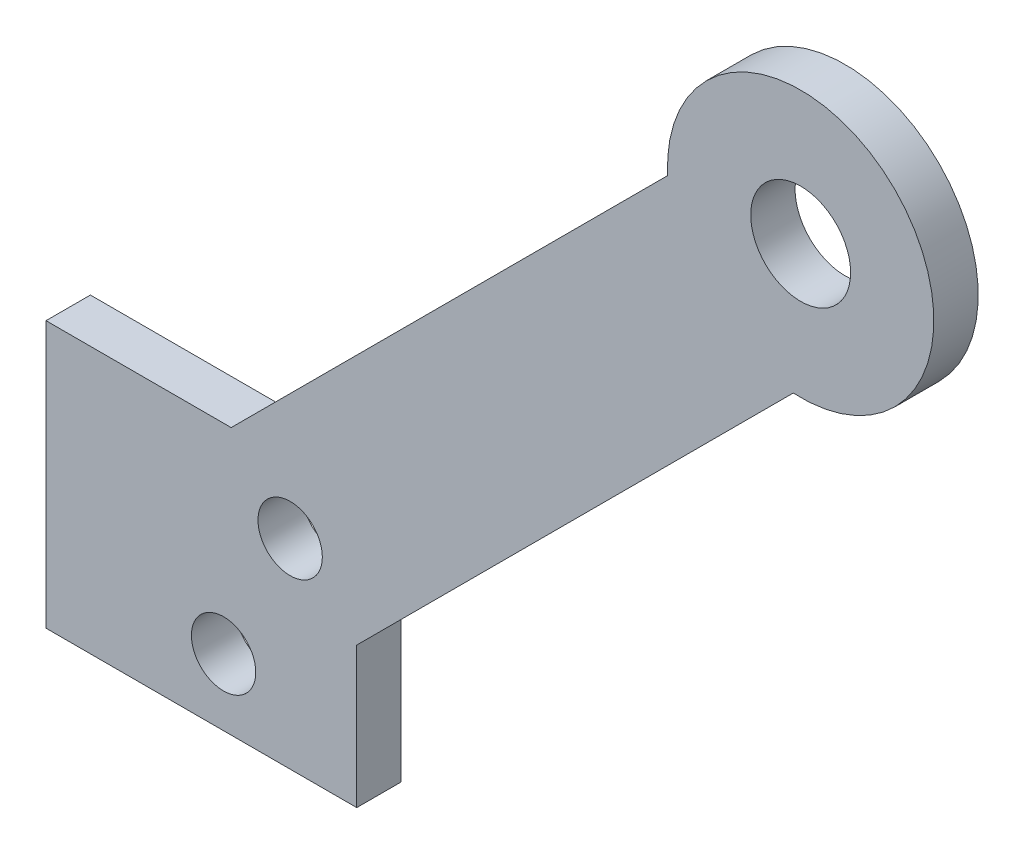
ISO-10303-21;
HEADER;
FILE_DESCRIPTION(('STEP AP214'),'2;1');
FILE_NAME('part.step','',(''),(''),'','','');
FILE_SCHEMA(('AUTOMOTIVE_DESIGN { 1 0 10303 214 1 1 1 1 }'));
ENDSEC;
DATA;
#1=APPLICATION_CONTEXT('core data for automotive mechanical design processes');
#2=APPLICATION_PROTOCOL_DEFINITION('international standard','automotive_design',2000,#1);
#3=PRODUCT_CONTEXT('',#1,'mechanical');
#4=PRODUCT('Part','Part','',(#3));
#5=PRODUCT_RELATED_PRODUCT_CATEGORY('part','',(#4));
#6=PRODUCT_DEFINITION_FORMATION('','',#4);
#7=PRODUCT_DEFINITION_CONTEXT('part definition',#1,'design');
#8=PRODUCT_DEFINITION('design','',#6,#7);
#9=PRODUCT_DEFINITION_SHAPE('','',#8);
#10=(LENGTH_UNIT() NAMED_UNIT(*) SI_UNIT(.MILLI.,.METRE.));
#11=(NAMED_UNIT(*) PLANE_ANGLE_UNIT() SI_UNIT($,.RADIAN.));
#12=(NAMED_UNIT(*) SI_UNIT($,.STERADIAN.) SOLID_ANGLE_UNIT());
#13=UNCERTAINTY_MEASURE_WITH_UNIT(LENGTH_MEASURE(1.E-05),#10,'distance_accuracy_value','');
#14=(GEOMETRIC_REPRESENTATION_CONTEXT(3) GLOBAL_UNCERTAINTY_ASSIGNED_CONTEXT((#13)) GLOBAL_UNIT_ASSIGNED_CONTEXT((#10,
#11,#12)) REPRESENTATION_CONTEXT('',''));
#15=CARTESIAN_POINT('',(0.,0.,0.));
#16=DIRECTION('',(0.,0.,1.));
#17=DIRECTION('',(1.,0.,0.));
#18=AXIS2_PLACEMENT_3D('',#15,#16,#17);
#19=CARTESIAN_POINT('',(49.8284271247462,44.1715728752538,2.));
#20=DIRECTION('',(-0.707106781186547,0.707106781186548,0.));
#21=DIRECTION('',(-0.707106781186548,-0.707106781186547,0.));
#22=AXIS2_PLACEMENT_3D('',#19,#20,#21);
#23=PLANE('',#22);
#24=DIRECTION('',(0.,0.,1.));
#25=VECTOR('',#24,1.);
#26=CARTESIAN_POINT('',(30.,24.3431457505076,2.));
#27=LINE('',#26,#25);
#28=CARTESIAN_POINT('',(30.,24.3431457505076,0.));
#29=VERTEX_POINT('',#28);
#30=CARTESIAN_POINT('',(30.,24.3431457505076,2.));
#31=VERTEX_POINT('',#30);
#32=EDGE_CURVE('E11',#29,#31,#27,.T.);
#33=ORIENTED_EDGE('',*,*,#32,.F.);
#34=DIRECTION('',(0.707106781186548,0.707106781186547,0.));
#35=VECTOR('',#34,1.);
#36=CARTESIAN_POINT('',(49.8284271247462,44.1715728752538,0.));
#37=LINE('',#36,#35);
#38=CARTESIAN_POINT('',(49.6661494645778,44.0092952150854,0.));
#39=VERTEX_POINT('',#38);
#40=EDGE_CURVE('E126',#29,#39,#37,.T.);
#41=ORIENTED_EDGE('',*,*,#40,.T.);
#42=DIRECTION('',(0.,0.,-1.));
#43=VECTOR('',#42,1.);
#44=CARTESIAN_POINT('',(49.6661494645778,44.0092952150854,2.));
#45=LINE('',#44,#43);
#46=CARTESIAN_POINT('',(49.6661494645778,44.0092952150854,2.));
#47=VERTEX_POINT('',#46);
#48=EDGE_CURVE('E155',#39,#47,#45,.F.);
#49=ORIENTED_EDGE('',*,*,#48,.T.);
#50=DIRECTION('',(0.707106781186548,0.707106781186547,0.));
#51=VECTOR('',#50,1.);
#52=CARTESIAN_POINT('',(49.8284271247462,44.1715728752538,2.));
#53=LINE('',#52,#51);
#54=EDGE_CURVE('E59',#31,#47,#53,.T.);
#55=ORIENTED_EDGE('',*,*,#54,.F.);
#56=EDGE_LOOP('',(#33,#41,#49,#55));
#57=FACE_BOUND('',#56,.T.);
#58=ADVANCED_FACE('F41',(#57),#23,.F.);
#59=CARTESIAN_POINT('',(21.1715728752538,26.8284271247462,2.));
#60=DIRECTION('',(0.707106781186548,-0.707106781186547,0.));
#61=DIRECTION('',(0.707106781186547,0.707106781186548,0.));
#62=AXIS2_PLACEMENT_3D('',#59,#60,#61);
#63=PLANE('',#62);
#64=DIRECTION('',(0.,0.,-1.));
#65=VECTOR('',#64,1.);
#66=CARTESIAN_POINT('',(24.3431457505076,30.,2.));
#67=LINE('',#66,#65);
#68=CARTESIAN_POINT('',(24.3431457505076,30.,2.));
#69=VERTEX_POINT('',#68);
#70=CARTESIAN_POINT('',(24.3431457505076,30.,0.));
#71=VERTEX_POINT('',#70);
#72=EDGE_CURVE('E49',#69,#71,#67,.T.);
#73=ORIENTED_EDGE('',*,*,#72,.F.);
#74=DIRECTION('',(-0.707106781186547,-0.707106781186548,0.));
#75=VECTOR('',#74,1.);
#76=CARTESIAN_POINT('',(21.1715728752538,26.8284271247462,2.));
#77=LINE('',#76,#75);
#78=CARTESIAN_POINT('',(44.0092952150854,49.6661494645778,2.));
#79=VERTEX_POINT('',#78);
#80=EDGE_CURVE('E133',#79,#69,#77,.T.);
#81=ORIENTED_EDGE('',*,*,#80,.F.);
#82=DIRECTION('',(0.,0.,-1.));
#83=VECTOR('',#82,1.);
#84=CARTESIAN_POINT('',(44.0092952150854,49.6661494645778,2.));
#85=LINE('',#84,#83);
#86=CARTESIAN_POINT('',(44.0092952150854,49.6661494645778,0.));
#87=VERTEX_POINT('',#86);
#88=EDGE_CURVE('E150',#79,#87,#85,.T.);
#89=ORIENTED_EDGE('',*,*,#88,.T.);
#90=DIRECTION('',(-0.707106781186547,-0.707106781186548,0.));
#91=VECTOR('',#90,1.);
#92=CARTESIAN_POINT('',(21.1715728752538,26.8284271247462,0.));
#93=LINE('',#92,#91);
#94=EDGE_CURVE('E127',#87,#71,#93,.T.);
#95=ORIENTED_EDGE('',*,*,#94,.T.);
#96=EDGE_LOOP('',(#73,#81,#89,#95));
#97=FACE_BOUND('',#96,.T.);
#98=ADVANCED_FACE('F195',(#97),#63,.F.);
#99=CARTESIAN_POINT('',(50.,50.,2.));
#100=DIRECTION('',(0.,0.,-1.));
#101=DIRECTION('',(-1.,0.,0.));
#102=AXIS2_PLACEMENT_3D('',#99,#100,#101);
#103=CYLINDRICAL_SURFACE('',#102,6.);
#104=ORIENTED_EDGE('',*,*,#48,.F.);
#105=CARTESIAN_POINT('',(50.,50.,0.));
#106=DIRECTION('',(0.,0.,1.));
#107=DIRECTION('',(1.,0.,0.));
#108=AXIS2_PLACEMENT_3D('',#105,#106,#107);
#109=CIRCLE('',#108,6.);
#110=EDGE_CURVE('E141',#39,#87,#109,.T.);
#111=ORIENTED_EDGE('',*,*,#110,.T.);
#112=ORIENTED_EDGE('',*,*,#88,.F.);
#113=CARTESIAN_POINT('',(50.,50.,2.));
#114=DIRECTION('',(0.,0.,1.));
#115=DIRECTION('',(1.,0.,0.));
#116=AXIS2_PLACEMENT_3D('',#113,#114,#115);
#117=CIRCLE('',#116,6.);
#118=EDGE_CURVE('E142',#47,#79,#117,.T.);
#119=ORIENTED_EDGE('',*,*,#118,.F.);
#120=EDGE_LOOP('',(#104,#111,#112,#119));
#121=FACE_BOUND('',#120,.T.);
#122=ADVANCED_FACE('F43',(#121),#103,.T.);
#123=CARTESIAN_POINT('',(50.,50.,2.));
#124=DIRECTION('',(0.,0.,1.));
#125=DIRECTION('',(1.,0.,0.));
#126=AXIS2_PLACEMENT_3D('',#123,#124,#125);
#127=PLANE('',#126);
#128=CARTESIAN_POINT('',(24.,21.,2.));
#129=DIRECTION('',(0.,0.,1.));
#130=DIRECTION('',(1.,0.,0.));
#131=AXIS2_PLACEMENT_3D('',#128,#129,#130);
#132=CIRCLE('',#131,1.45);
#133=CARTESIAN_POINT('',(25.45,21.,2.));
#134=VERTEX_POINT('',#133);
#135=EDGE_CURVE('E160',#134,#134,#132,.T.);
#136=ORIENTED_EDGE('',*,*,#135,.F.);
#137=EDGE_LOOP('',(#136));
#138=FACE_BOUND('',#137,.T.);
#139=CARTESIAN_POINT('',(27.,27.,2.));
#140=DIRECTION('',(0.,0.,1.));
#141=DIRECTION('',(1.,0.,0.));
#142=AXIS2_PLACEMENT_3D('',#139,#140,#141);
#143=CIRCLE('',#142,1.45);
#144=CARTESIAN_POINT('',(28.45,27.,2.));
#145=VERTEX_POINT('',#144);
#146=EDGE_CURVE('E165',#145,#145,#143,.T.);
#147=ORIENTED_EDGE('',*,*,#146,.F.);
#148=EDGE_LOOP('',(#147));
#149=FACE_BOUND('',#148,.T.);
#150=DIRECTION('',(0.,1.,0.));
#151=VECTOR('',#150,1.);
#152=CARTESIAN_POINT('',(30.,18.,2.));
#153=LINE('',#152,#151);
#154=CARTESIAN_POINT('',(30.,18.,2.));
#155=VERTEX_POINT('',#154);
#156=EDGE_CURVE('E110',#155,#31,#153,.T.);
#157=ORIENTED_EDGE('',*,*,#156,.T.);
#158=ORIENTED_EDGE('',*,*,#54,.T.);
#159=ORIENTED_EDGE('',*,*,#118,.T.);
#160=ORIENTED_EDGE('',*,*,#80,.T.);
#161=DIRECTION('',(-1.,0.,0.));
#162=VECTOR('',#161,1.);
#163=CARTESIAN_POINT('',(16.,30.,2.));
#164=LINE('',#163,#162);
#165=CARTESIAN_POINT('',(16.,30.,2.));
#166=VERTEX_POINT('',#165);
#167=EDGE_CURVE('E120',#69,#166,#164,.T.);
#168=ORIENTED_EDGE('',*,*,#167,.T.);
#169=DIRECTION('',(0.,-1.,0.));
#170=VECTOR('',#169,1.);
#171=CARTESIAN_POINT('',(16.,18.,2.));
#172=LINE('',#171,#170);
#173=CARTESIAN_POINT('',(16.,18.,2.));
#174=VERTEX_POINT('',#173);
#175=EDGE_CURVE('E109',#166,#174,#172,.T.);
#176=ORIENTED_EDGE('',*,*,#175,.T.);
#177=DIRECTION('',(1.,0.,0.));
#178=VECTOR('',#177,1.);
#179=CARTESIAN_POINT('',(16.,18.,2.));
#180=LINE('',#179,#178);
#181=EDGE_CURVE('E100',#174,#155,#180,.T.);
#182=ORIENTED_EDGE('',*,*,#181,.T.);
#183=EDGE_LOOP('',(#157,#158,#159,#160,#168,#176,#182));
#184=FACE_BOUND('',#183,.T.);
#185=CARTESIAN_POINT('',(50.,50.,2.));
#186=DIRECTION('',(0.,0.,1.));
#187=DIRECTION('',(1.,0.,0.));
#188=AXIS2_PLACEMENT_3D('',#185,#186,#187);
#189=CIRCLE('',#188,2.25);
#190=CARTESIAN_POINT('',(52.25,50.,2.));
#191=VERTEX_POINT('',#190);
#192=EDGE_CURVE('E138',#191,#191,#189,.T.);
#193=ORIENTED_EDGE('',*,*,#192,.F.);
#194=EDGE_LOOP('',(#193));
#195=FACE_BOUND('',#194,.T.);
#196=ADVANCED_FACE('F111',(#138,#149,#184,#195),#127,.T.);
#197=CARTESIAN_POINT('',(50.,50.,0.));
#198=DIRECTION('',(0.,0.,1.));
#199=DIRECTION('',(1.,0.,0.));
#200=AXIS2_PLACEMENT_3D('',#197,#198,#199);
#201=PLANE('',#200);
#202=CARTESIAN_POINT('',(24.,21.,0.));
#203=DIRECTION('',(0.,0.,1.));
#204=DIRECTION('',(1.,0.,0.));
#205=AXIS2_PLACEMENT_3D('',#202,#203,#204);
#206=CIRCLE('',#205,1.45);
#207=CARTESIAN_POINT('',(25.45,21.,0.));
#208=VERTEX_POINT('',#207);
#209=EDGE_CURVE('E44',#208,#208,#206,.T.);
#210=ORIENTED_EDGE('',*,*,#209,.T.);
#211=EDGE_LOOP('',(#210));
#212=FACE_BOUND('',#211,.T.);
#213=CARTESIAN_POINT('',(27.,27.,0.));
#214=DIRECTION('',(0.,0.,1.));
#215=DIRECTION('',(1.,0.,0.));
#216=AXIS2_PLACEMENT_3D('',#213,#214,#215);
#217=CIRCLE('',#216,1.45);
#218=CARTESIAN_POINT('',(28.45,27.,0.));
#219=VERTEX_POINT('',#218);
#220=EDGE_CURVE('E154',#219,#219,#217,.T.);
#221=ORIENTED_EDGE('',*,*,#220,.T.);
#222=EDGE_LOOP('',(#221));
#223=FACE_BOUND('',#222,.T.);
#224=ORIENTED_EDGE('',*,*,#40,.F.);
#225=DIRECTION('',(0.,1.,0.));
#226=VECTOR('',#225,1.);
#227=CARTESIAN_POINT('',(30.,18.,0.));
#228=LINE('',#227,#226);
#229=CARTESIAN_POINT('',(30.,18.,0.));
#230=VERTEX_POINT('',#229);
#231=EDGE_CURVE('E171',#230,#29,#228,.T.);
#232=ORIENTED_EDGE('',*,*,#231,.F.);
#233=DIRECTION('',(1.,0.,0.));
#234=VECTOR('',#233,1.);
#235=CARTESIAN_POINT('',(16.,18.,0.));
#236=LINE('',#235,#234);
#237=CARTESIAN_POINT('',(16.,18.,0.));
#238=VERTEX_POINT('',#237);
#239=EDGE_CURVE('E174',#238,#230,#236,.T.);
#240=ORIENTED_EDGE('',*,*,#239,.F.);
#241=DIRECTION('',(0.,-1.,0.));
#242=VECTOR('',#241,1.);
#243=CARTESIAN_POINT('',(16.,18.,0.));
#244=LINE('',#243,#242);
#245=CARTESIAN_POINT('',(16.,30.,0.));
#246=VERTEX_POINT('',#245);
#247=EDGE_CURVE('E124',#246,#238,#244,.T.);
#248=ORIENTED_EDGE('',*,*,#247,.F.);
#249=DIRECTION('',(-1.,0.,0.));
#250=VECTOR('',#249,1.);
#251=CARTESIAN_POINT('',(16.,30.,0.));
#252=LINE('',#251,#250);
#253=EDGE_CURVE('E121',#71,#246,#252,.T.);
#254=ORIENTED_EDGE('',*,*,#253,.F.);
#255=ORIENTED_EDGE('',*,*,#94,.F.);
#256=ORIENTED_EDGE('',*,*,#110,.F.);
#257=EDGE_LOOP('',(#224,#232,#240,#248,#254,#255,#256));
#258=FACE_BOUND('',#257,.T.);
#259=CARTESIAN_POINT('',(50.,50.,0.));
#260=DIRECTION('',(0.,0.,1.));
#261=DIRECTION('',(1.,0.,0.));
#262=AXIS2_PLACEMENT_3D('',#259,#260,#261);
#263=CIRCLE('',#262,2.25);
#264=CARTESIAN_POINT('',(52.25,50.,0.));
#265=VERTEX_POINT('',#264);
#266=EDGE_CURVE('E136',#265,#265,#263,.T.);
#267=ORIENTED_EDGE('',*,*,#266,.T.);
#268=EDGE_LOOP('',(#267));
#269=FACE_BOUND('',#268,.T.);
#270=ADVANCED_FACE('F179',(#212,#223,#258,#269),#201,.F.);
#271=CARTESIAN_POINT('',(50.,50.,2.));
#272=DIRECTION('',(0.,0.,-1.));
#273=DIRECTION('',(-1.,0.,0.));
#274=AXIS2_PLACEMENT_3D('',#271,#272,#273);
#275=CYLINDRICAL_SURFACE('',#274,2.25);
#276=ORIENTED_EDGE('',*,*,#192,.T.);
#277=EDGE_LOOP('',(#276));
#278=FACE_BOUND('',#277,.T.);
#279=ORIENTED_EDGE('',*,*,#266,.F.);
#280=EDGE_LOOP('',(#279));
#281=FACE_BOUND('',#280,.T.);
#282=ADVANCED_FACE('F201',(#278,#281),#275,.F.);
#283=CARTESIAN_POINT('',(30.,18.,2.));
#284=DIRECTION('',(-1.,0.,0.));
#285=DIRECTION('',(0.,0.,1.));
#286=AXIS2_PLACEMENT_3D('',#283,#284,#285);
#287=PLANE('',#286);
#288=ORIENTED_EDGE('',*,*,#231,.T.);
#289=ORIENTED_EDGE('',*,*,#32,.T.);
#290=ORIENTED_EDGE('',*,*,#156,.F.);
#291=DIRECTION('',(0.,0.,-1.));
#292=VECTOR('',#291,1.);
#293=CARTESIAN_POINT('',(30.,18.,2.));
#294=LINE('',#293,#292);
#295=EDGE_CURVE('E104',#155,#230,#294,.T.);
#296=ORIENTED_EDGE('',*,*,#295,.T.);
#297=EDGE_LOOP('',(#288,#289,#290,#296));
#298=FACE_BOUND('',#297,.T.);
#299=ADVANCED_FACE('F184',(#298),#287,.F.);
#300=CARTESIAN_POINT('',(16.,30.,2.));
#301=DIRECTION('',(0.,-1.,0.));
#302=DIRECTION('',(0.,0.,-1.));
#303=AXIS2_PLACEMENT_3D('',#300,#301,#302);
#304=PLANE('',#303);
#305=ORIENTED_EDGE('',*,*,#167,.F.);
#306=ORIENTED_EDGE('',*,*,#72,.T.);
#307=ORIENTED_EDGE('',*,*,#253,.T.);
#308=DIRECTION('',(0.,0.,-1.));
#309=VECTOR('',#308,1.);
#310=CARTESIAN_POINT('',(16.,30.,2.));
#311=LINE('',#310,#309);
#312=EDGE_CURVE('E129',#166,#246,#311,.T.);
#313=ORIENTED_EDGE('',*,*,#312,.F.);
#314=EDGE_LOOP('',(#305,#306,#307,#313));
#315=FACE_BOUND('',#314,.T.);
#316=ADVANCED_FACE('F193',(#315),#304,.F.);
#317=CARTESIAN_POINT('',(16.,18.,2.));
#318=DIRECTION('',(1.,0.,0.));
#319=DIRECTION('',(0.,0.,-1.));
#320=AXIS2_PLACEMENT_3D('',#317,#318,#319);
#321=PLANE('',#320);
#322=ORIENTED_EDGE('',*,*,#247,.T.);
#323=DIRECTION('',(0.,0.,-1.));
#324=VECTOR('',#323,1.);
#325=CARTESIAN_POINT('',(16.,18.,2.));
#326=LINE('',#325,#324);
#327=EDGE_CURVE('E105',#174,#238,#326,.T.);
#328=ORIENTED_EDGE('',*,*,#327,.F.);
#329=ORIENTED_EDGE('',*,*,#175,.F.);
#330=ORIENTED_EDGE('',*,*,#312,.T.);
#331=EDGE_LOOP('',(#322,#328,#329,#330));
#332=FACE_BOUND('',#331,.T.);
#333=ADVANCED_FACE('F123',(#332),#321,.F.);
#334=CARTESIAN_POINT('',(16.,18.,2.));
#335=DIRECTION('',(0.,1.,0.));
#336=DIRECTION('',(0.,0.,1.));
#337=AXIS2_PLACEMENT_3D('',#334,#335,#336);
#338=PLANE('',#337);
#339=ORIENTED_EDGE('',*,*,#239,.T.);
#340=ORIENTED_EDGE('',*,*,#295,.F.);
#341=ORIENTED_EDGE('',*,*,#181,.F.);
#342=ORIENTED_EDGE('',*,*,#327,.T.);
#343=EDGE_LOOP('',(#339,#340,#341,#342));
#344=FACE_BOUND('',#343,.T.);
#345=ADVANCED_FACE('F98',(#344),#338,.F.);
#346=CARTESIAN_POINT('',(27.,27.,-0.01));
#347=DIRECTION('',(0.,0.,1.));
#348=DIRECTION('',(1.,0.,0.));
#349=AXIS2_PLACEMENT_3D('',#346,#347,#348);
#350=CYLINDRICAL_SURFACE('',#349,1.45);
#351=ORIENTED_EDGE('',*,*,#146,.T.);
#352=EDGE_LOOP('',(#351));
#353=FACE_BOUND('',#352,.T.);
#354=ORIENTED_EDGE('',*,*,#220,.F.);
#355=EDGE_LOOP('',(#354));
#356=FACE_BOUND('',#355,.T.);
#357=ADVANCED_FACE('F226',(#353,#356),#350,.F.);
#358=CARTESIAN_POINT('',(24.,21.,-0.01));
#359=DIRECTION('',(0.,0.,1.));
#360=DIRECTION('',(1.,0.,0.));
#361=AXIS2_PLACEMENT_3D('',#358,#359,#360);
#362=CYLINDRICAL_SURFACE('',#361,1.45);
#363=ORIENTED_EDGE('',*,*,#135,.T.);
#364=EDGE_LOOP('',(#363));
#365=FACE_BOUND('',#364,.T.);
#366=ORIENTED_EDGE('',*,*,#209,.F.);
#367=EDGE_LOOP('',(#366));
#368=FACE_BOUND('',#367,.T.);
#369=ADVANCED_FACE('F221',(#365,#368),#362,.F.);
#370=CLOSED_SHELL('',(#58,#98,#122,#196,#270,#282,#299,#316,#333,#345,#357,#369));
#371=MANIFOLD_SOLID_BREP('B2',#370);
#372=ADVANCED_BREP_SHAPE_REPRESENTATION('',(#18,#371),#14);
#373=SHAPE_DEFINITION_REPRESENTATION(#9,#372);
ENDSEC;
END-ISO-10303-21;
